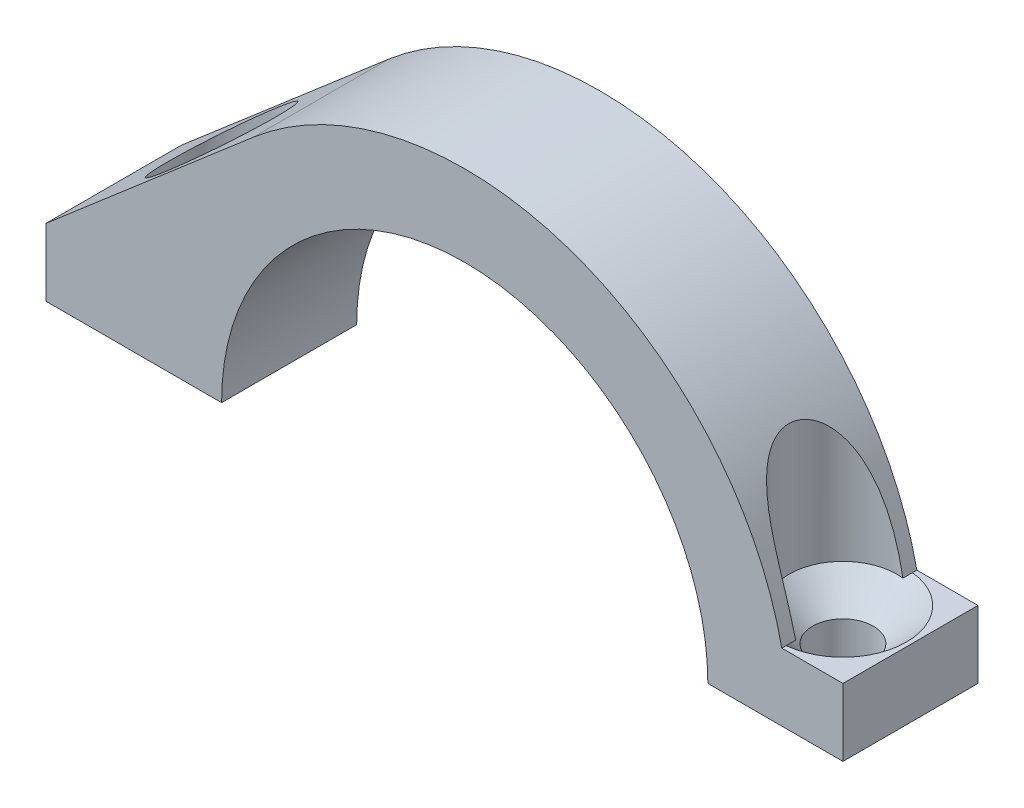
ISO-10303-21;
HEADER;
FILE_DESCRIPTION(('STEP AP214'),'2;1');
FILE_NAME('part.step','',(''),(''),'','','');
FILE_SCHEMA(('AUTOMOTIVE_DESIGN { 1 0 10303 214 1 1 1 1 }'));
ENDSEC;
DATA;
#1=APPLICATION_CONTEXT('core data for automotive mechanical design processes');
#2=APPLICATION_PROTOCOL_DEFINITION('international standard','automotive_design',2000,#1);
#3=PRODUCT_CONTEXT('',#1,'mechanical');
#4=PRODUCT('Part','Part','',(#3));
#5=PRODUCT_RELATED_PRODUCT_CATEGORY('part','',(#4));
#6=PRODUCT_DEFINITION_FORMATION('','',#4);
#7=PRODUCT_DEFINITION_CONTEXT('part definition',#1,'design');
#8=PRODUCT_DEFINITION('design','',#6,#7);
#9=PRODUCT_DEFINITION_SHAPE('','',#8);
#10=(LENGTH_UNIT() NAMED_UNIT(*) SI_UNIT(.MILLI.,.METRE.));
#11=(NAMED_UNIT(*) PLANE_ANGLE_UNIT() SI_UNIT($,.RADIAN.));
#12=(NAMED_UNIT(*) SI_UNIT($,.STERADIAN.) SOLID_ANGLE_UNIT());
#13=UNCERTAINTY_MEASURE_WITH_UNIT(LENGTH_MEASURE(1.E-05),#10,'distance_accuracy_value','');
#14=(GEOMETRIC_REPRESENTATION_CONTEXT(3) GLOBAL_UNCERTAINTY_ASSIGNED_CONTEXT((#13)) GLOBAL_UNIT_ASSIGNED_CONTEXT((#10,
#11,#12)) REPRESENTATION_CONTEXT('',''));
#15=CARTESIAN_POINT('',(0.,0.,0.));
#16=DIRECTION('',(0.,0.,1.));
#17=DIRECTION('',(1.,0.,0.));
#18=AXIS2_PLACEMENT_3D('',#15,#16,#17);
#19=CARTESIAN_POINT('',(77.,31.,131.694583757177));
#20=DIRECTION('',(0.,-1.,0.));
#21=DIRECTION('',(0.,0.,-1.));
#22=AXIS2_PLACEMENT_3D('',#19,#20,#21);
#23=PLANE('',#22);
#24=CARTESIAN_POINT('',(72.,31.,63.));
#25=DIRECTION('',(0.,1.,0.));
#26=DIRECTION('',(0.,0.,1.));
#27=AXIS2_PLACEMENT_3D('',#24,#25,#26);
#28=CIRCLE('',#27,4.7);
#29=CARTESIAN_POINT('',(72.473389188611,31.,67.6760990874987));
#30=VERTEX_POINT('',#29);
#31=CARTESIAN_POINT('',(72.473389188611,31.,58.3239009125013));
#32=VERTEX_POINT('',#31);
#33=EDGE_CURVE('E122',#30,#32,#28,.T.);
#34=ORIENTED_EDGE('',*,*,#33,.F.);
#35=DIRECTION('',(0.,0.,-1.));
#36=VECTOR('',#35,1.);
#37=CARTESIAN_POINT('',(72.473389188611,31.,131.694583757177));
#38=LINE('',#37,#36);
#39=CARTESIAN_POINT('',(72.473389188611,31.,68.));
#40=VERTEX_POINT('',#39);
#41=EDGE_CURVE('E61',#40,#30,#38,.T.);
#42=ORIENTED_EDGE('',*,*,#41,.F.);
#43=DIRECTION('',(-1.,0.,0.));
#44=VECTOR('',#43,1.);
#45=CARTESIAN_POINT('',(77.,31.,68.));
#46=LINE('',#45,#44);
#47=CARTESIAN_POINT('',(77.,31.,68.));
#48=VERTEX_POINT('',#47);
#49=EDGE_CURVE('E168',#48,#40,#46,.T.);
#50=ORIENTED_EDGE('',*,*,#49,.F.);
#51=DIRECTION('',(0.,0.,-1.));
#52=VECTOR('',#51,1.);
#53=CARTESIAN_POINT('',(77.,31.,131.694583757177));
#54=LINE('',#53,#52);
#55=CARTESIAN_POINT('',(77.,31.,58.));
#56=VERTEX_POINT('',#55);
#57=EDGE_CURVE('E185',#48,#56,#54,.T.);
#58=ORIENTED_EDGE('',*,*,#57,.T.);
#59=DIRECTION('',(-1.,0.,0.));
#60=VECTOR('',#59,1.);
#61=CARTESIAN_POINT('',(77.,31.,58.));
#62=LINE('',#61,#60);
#63=CARTESIAN_POINT('',(72.473389188611,31.,58.));
#64=VERTEX_POINT('',#63);
#65=EDGE_CURVE('E131',#56,#64,#62,.T.);
#66=ORIENTED_EDGE('',*,*,#65,.T.);
#67=EDGE_CURVE('E129',#32,#64,#38,.T.);
#68=ORIENTED_EDGE('',*,*,#67,.F.);
#69=EDGE_LOOP('',(#34,#42,#50,#58,#66,#68));
#70=FACE_BOUND('',#69,.T.);
#71=ADVANCED_FACE('F37',(#70),#23,.F.);
#72=CARTESIAN_POINT('',(49.,26.,131.694583757177));
#73=DIRECTION('',(0.,0.,-1.));
#74=DIRECTION('',(-1.,0.,0.));
#75=AXIS2_PLACEMENT_3D('',#72,#73,#74);
#76=CYLINDRICAL_SURFACE('',#75,24.);
#77=CARTESIAN_POINT('',(72.473389188611,31.,66.9718890563693));
#78=CARTESIAN_POINT('',(72.4250650791664,31.2268711392969,66.9776331855018));
#79=CARTESIAN_POINT('',(72.3734461474687,31.4530587467021,66.9829056037757));
#80=CARTESIAN_POINT('',(72.2636570800879,31.9039039872218,66.9916852627396));
#81=CARTESIAN_POINT('',(72.2054860659855,32.128561410897,66.9951922664));
#82=CARTESIAN_POINT('',(72.0824145924022,32.5769591768231,66.9996256302939));
#83=CARTESIAN_POINT('',(72.01748978205,32.8006929482492,67.0005422913498));
#84=CARTESIAN_POINT('',(71.881159260786,33.2461578035322,66.9988156818458));
#85=CARTESIAN_POINT('',(71.8097538177651,33.4678889697548,66.9961725583749));
#86=CARTESIAN_POINT('',(71.6580581296328,33.9164581691707,66.9861067022832));
#87=CARTESIAN_POINT('',(71.5775508775882,34.1432196256084,66.9785273781311));
#88=CARTESIAN_POINT('',(71.4098570493667,34.593958392639,66.9571299540315));
#89=CARTESIAN_POINT('',(71.3226708749897,34.8179358697737,66.943312229138));
#90=CARTESIAN_POINT('',(71.1419758618108,35.262307236795,66.9079736779552));
#91=CARTESIAN_POINT('',(71.0484773968963,35.4827063019824,66.8864652524014));
#92=CARTESIAN_POINT('',(70.8553801827718,35.9196463809305,66.8340390674355));
#93=CARTESIAN_POINT('',(70.7557828287104,36.1361882625171,66.8031234535856));
#94=CARTESIAN_POINT('',(70.5520794699918,36.5623399473483,66.7302951539474));
#95=CARTESIAN_POINT('',(70.4480343805081,36.7719995622659,66.6885059005004));
#96=CARTESIAN_POINT('',(70.2351323873239,37.1858526701946,66.5915090250424));
#97=CARTESIAN_POINT('',(70.1262738007065,37.3900442107245,66.5362966791511));
#98=CARTESIAN_POINT('',(69.9058354978617,37.7897269717554,66.4103459934722));
#99=CARTESIAN_POINT('',(69.7942867073086,37.9852773131873,66.3397433652946));
#100=CARTESIAN_POINT('',(69.5693543955666,38.3673240849149,66.1797793305868));
#101=CARTESIAN_POINT('',(69.4559726315941,38.5538285720044,66.0904350088676));
#102=CARTESIAN_POINT('',(69.2315957300724,38.9122624591335,65.8910426614215));
#103=CARTESIAN_POINT('',(69.1205907869889,39.0843725514715,65.7813359046453));
#104=CARTESIAN_POINT('',(68.9028828163513,39.4132039539724,65.5366648682736));
#105=CARTESIAN_POINT('',(68.7961810731682,39.5699206894426,65.4016931146905));
#106=CARTESIAN_POINT('',(68.6085381504611,39.8393627962973,65.1263357240916));
#107=CARTESIAN_POINT('',(68.5261580898304,39.9551475145525,64.989969589615));
#108=CARTESIAN_POINT('',(68.3736099804366,40.166161917671,64.6960454600736));
#109=CARTESIAN_POINT('',(68.3034212633906,40.2614264580732,64.5385241501844));
#110=CARTESIAN_POINT('',(68.195343927833,40.4064230101088,64.2423325650273));
#111=CARTESIAN_POINT('',(68.153739293605,40.4615891360785,64.107696214171));
#112=CARTESIAN_POINT('',(68.0841806320974,40.5532601618473,63.8288246344592));
#113=CARTESIAN_POINT('',(68.0562171300845,40.5897780150216,63.6845961473697));
#114=CARTESIAN_POINT('',(68.0161930630766,40.6419099719296,63.3893313580019));
#115=CARTESIAN_POINT('',(68.0042225232088,40.6574057488873,63.2382614255921));
#116=CARTESIAN_POINT('',(67.9976563844559,40.6659160186484,62.9351138890682));
#117=CARTESIAN_POINT('',(68.0030573082591,40.6589350107145,62.7830364927036));
#118=CARTESIAN_POINT('',(68.029468436556,40.6246268988265,62.4961883473167));
#119=CARTESIAN_POINT('',(68.04908272042,40.5991188797448,62.3610613575964));
#120=CARTESIAN_POINT('',(68.1008009755964,40.5313870202061,62.0976164728754));
#121=CARTESIAN_POINT('',(68.132908660065,40.4891582101072,61.9693006151037));
#122=CARTESIAN_POINT('',(68.2191008817847,40.3747240802118,61.683396284398));
#123=CARTESIAN_POINT('',(68.2769111591643,40.297287037285,61.5290276392855));
#124=CARTESIAN_POINT('',(68.405412043333,40.1223869921584,61.2380778772918));
#125=CARTESIAN_POINT('',(68.476125793224,40.024887966903,61.1015294892161));
#126=CARTESIAN_POINT('',(68.6584534271508,39.7687734293612,60.7911464248248));
#127=CARTESIAN_POINT('',(68.7745339200808,39.6019573975962,60.6267087077138));
#128=CARTESIAN_POINT('',(68.9543843743535,39.335452131829,60.405139629645));
#129=CARTESIAN_POINT('',(69.0153727370295,39.2437733264225,60.3353900320692));
#130=CARTESIAN_POINT('',(69.1385066498199,39.0557698293778,60.2035776680283));
#131=CARTESIAN_POINT('',(69.2006520031764,38.959445923334,60.1415136080509));
#132=CARTESIAN_POINT('',(69.3672778895896,38.696920313221,59.9851617526234));
#133=CARTESIAN_POINT('',(69.4721755846451,38.5272131121888,59.8972072511601));
#134=CARTESIAN_POINT('',(69.6809689049098,38.1794398124759,59.7382038656125));
#135=CARTESIAN_POINT('',(69.7848637738868,38.0013679218141,59.6671669086951));
#136=CARTESIAN_POINT('',(69.9902640849288,37.6384013782892,59.5394204420879));
#137=CARTESIAN_POINT('',(70.0917646903898,37.4534945783345,59.4827379997436));
#138=CARTESIAN_POINT('',(70.2911700779734,37.0784125855758,59.3816583741471));
#139=CARTESIAN_POINT('',(70.3890734593067,36.8882353899614,59.3372659336599));
#140=CARTESIAN_POINT('',(70.5781616709814,36.5084169940377,59.2598735315324));
#141=CARTESIAN_POINT('',(70.6694530467959,36.3188801396474,59.2266176466991));
#142=CARTESIAN_POINT('',(70.8474574651507,35.936452479051,59.1684979626386));
#143=CARTESIAN_POINT('',(70.9341711156103,35.7435621227334,59.1436330467188));
#144=CARTESIAN_POINT('',(71.1028069646286,35.3547247536302,59.1009465931729));
#145=CARTESIAN_POINT('',(71.1847245934247,35.1587750439112,59.0831316828051));
#146=CARTESIAN_POINT('',(71.3434768493495,34.7643741290587,59.0534206633665));
#147=CARTESIAN_POINT('',(71.4203108762924,34.5659226318376,59.0415252520931));
#148=CARTESIAN_POINT('',(71.6429970785652,33.9671823948186,59.0131438773194));
#149=CARTESIAN_POINT('',(71.7809932807672,33.5636003076876,59.0039718658667));
#150=CARTESIAN_POINT('',(72.035208912042,32.7498764392346,58.9981397621313));
#151=CARTESIAN_POINT('',(72.1514403448888,32.3397384099504,59.0014727515856));
#152=CARTESIAN_POINT('',(72.2958782074375,31.7729802040001,59.0107661632584));
#153=CARTESIAN_POINT('',(72.3335745391265,31.6186768485066,59.0137679674909));
#154=CARTESIAN_POINT('',(72.4058176602134,31.3096906858641,59.0204741164517));
#155=CARTESIAN_POINT('',(72.4403708826279,31.1550093509678,59.0241769761407));
#156=CARTESIAN_POINT('',(72.473389188611,31.,59.0281109436307));
#157=B_SPLINE_CURVE_WITH_KNOTS('',3,(#77,#78,#79,#80,#81,#82,#83,#84,#85,#86,#87,#88,#89,#90,
#91,#92,#93,#94,#95,#96,#97,#98,#99,#100,#101,#102,#103,#104,#105,#106,#107,#108,#109,#110,#111,
#112,#113,#114,#115,#116,#117,#118,#119,#120,#121,#122,#123,#124,#125,#126,#127,#128,#129,#130,
#131,#132,#133,#134,#135,#136,#137,#138,#139,#140,#141,#142,#143,#144,#145,#146,#147,#148,#149,
#150,#151,#152,#153,#154,#155,#156),.UNSPECIFIED.,.F.,.F.,(4,2,2,2,2,2,2,2,2,2,2,2,2,2,2,2,2,2,
2,2,2,2,2,2,2,2,2,2,2,2,2,2,2,2,2,2,2,2,2,4),(0.,0.696079965731022,1.39225336428133,
2.09103005521188,2.78977787384722,3.51184886403787,4.23387644893941,4.95474502458975,
5.67544930986068,6.38830463881225,7.10141120123182,7.80846711829467,8.5148812670198,
9.21037920944285,9.90608322280558,10.4948744722677,11.0826575744074,11.5348480499809,
11.986723998433,12.4411330087113,12.8954510638791,13.310324888613,13.725322112045,
14.2686640601332,14.8129902760812,15.5926099098077,15.9834400374184,16.3742042968149,
17.0272603900001,17.6807755451872,18.3355139653647,18.9905047008536,19.6292022709265,
20.2678148078614,20.907026245569,21.5463130164085,22.8251892272896,24.1033580174219,
24.5799417050787,25.055526921944),.UNSPECIFIED.);
#158=CARTESIAN_POINT('',(72.473389188611,31.,66.9718890563693));
#159=VERTEX_POINT('',#158);
#160=CARTESIAN_POINT('',(72.473389188611,31.,59.0281109436307));
#161=VERTEX_POINT('',#160);
#162=EDGE_CURVE('E140',#159,#161,#157,.T.);
#163=ORIENTED_EDGE('',*,*,#162,.T.);
#164=EDGE_CURVE('E118',#161,#32,#38,.T.);
#165=ORIENTED_EDGE('',*,*,#164,.T.);
#166=ORIENTED_EDGE('',*,*,#67,.T.);
#167=CARTESIAN_POINT('',(49.,26.,58.));
#168=DIRECTION('',(0.,0.,1.));
#169=DIRECTION('',(1.,0.,0.));
#170=AXIS2_PLACEMENT_3D('',#167,#168,#169);
#171=CIRCLE('',#170,24.);
#172=CARTESIAN_POINT('',(33.35478175229,44.1996468641983,58.));
#173=VERTEX_POINT('',#172);
#174=EDGE_CURVE('E142',#64,#173,#171,.T.);
#175=ORIENTED_EDGE('',*,*,#174,.T.);
#176=DIRECTION('',(0.,0.,-1.));
#177=VECTOR('',#176,1.);
#178=CARTESIAN_POINT('',(33.35478175229,44.1996468641983,131.694583757177));
#179=LINE('',#178,#177);
#180=CARTESIAN_POINT('',(33.35478175229,44.1996468641983,68.));
#181=VERTEX_POINT('',#180);
#182=EDGE_CURVE('E143',#181,#173,#179,.T.);
#183=ORIENTED_EDGE('',*,*,#182,.F.);
#184=CARTESIAN_POINT('',(49.,26.,68.));
#185=DIRECTION('',(0.,0.,1.));
#186=DIRECTION('',(1.,0.,0.));
#187=AXIS2_PLACEMENT_3D('',#184,#185,#186);
#188=CIRCLE('',#187,24.);
#189=EDGE_CURVE('E165',#40,#181,#188,.T.);
#190=ORIENTED_EDGE('',*,*,#189,.F.);
#191=ORIENTED_EDGE('',*,*,#41,.T.);
#192=EDGE_CURVE('E121',#30,#159,#38,.T.);
#193=ORIENTED_EDGE('',*,*,#192,.T.);
#194=EDGE_LOOP('',(#163,#165,#166,#175,#183,#190,#191,#193));
#195=FACE_BOUND('',#194,.T.);
#196=ADVANCED_FACE('F138',(#195),#76,.T.);
#197=CARTESIAN_POINT('',(18.,31.,131.694583757177));
#198=DIRECTION('',(0.651884093654582,-0.758318619341596,0.));
#199=DIRECTION('',(0.758318619341596,0.651884093654582,0.));
#200=AXIS2_PLACEMENT_3D('',#197,#198,#199);
#201=PLANE('',#200);
#202=CARTESIAN_POINT('',(26.,37.8771524478254,63.));
#203=DIRECTION('',(0.651884093654582,-0.758318619341596,0.));
#204=DIRECTION('',(-0.758318619341596,-0.651884093654582,0.));
#205=AXIS2_PLACEMENT_3D('',#202,#203,#204);
#206=ELLIPSE('',#205,5.27482762255392,4.);
#207=CARTESIAN_POINT('',(22.,34.4385762239127,63.));
#208=VERTEX_POINT('',#207);
#209=EDGE_CURVE('E135',#208,#208,#206,.T.);
#210=ORIENTED_EDGE('',*,*,#209,.T.);
#211=EDGE_LOOP('',(#210));
#212=FACE_BOUND('',#211,.T.);
#213=DIRECTION('',(-0.758318619341596,-0.651884093654582,0.));
#214=VECTOR('',#213,1.);
#215=CARTESIAN_POINT('',(18.,31.,68.));
#216=LINE('',#215,#214);
#217=CARTESIAN_POINT('',(18.,31.,68.));
#218=VERTEX_POINT('',#217);
#219=EDGE_CURVE('E162',#181,#218,#216,.T.);
#220=ORIENTED_EDGE('',*,*,#219,.F.);
#221=ORIENTED_EDGE('',*,*,#182,.T.);
#222=DIRECTION('',(-0.758318619341596,-0.651884093654582,0.));
#223=VECTOR('',#222,1.);
#224=CARTESIAN_POINT('',(18.,31.,58.));
#225=LINE('',#224,#223);
#226=CARTESIAN_POINT('',(18.,31.,58.));
#227=VERTEX_POINT('',#226);
#228=EDGE_CURVE('E146',#173,#227,#225,.T.);
#229=ORIENTED_EDGE('',*,*,#228,.T.);
#230=DIRECTION('',(0.,0.,-1.));
#231=VECTOR('',#230,1.);
#232=CARTESIAN_POINT('',(18.,31.,131.694583757177));
#233=LINE('',#232,#231);
#234=EDGE_CURVE('E171',#218,#227,#233,.T.);
#235=ORIENTED_EDGE('',*,*,#234,.F.);
#236=EDGE_LOOP('',(#220,#221,#229,#235));
#237=FACE_BOUND('',#236,.T.);
#238=ADVANCED_FACE('F216',(#212,#237),#201,.F.);
#239=CARTESIAN_POINT('',(18.,26.,131.694583757177));
#240=DIRECTION('',(1.,0.,0.));
#241=DIRECTION('',(0.,0.,-1.));
#242=AXIS2_PLACEMENT_3D('',#239,#240,#241);
#243=PLANE('',#242);
#244=DIRECTION('',(0.,-1.,0.));
#245=VECTOR('',#244,1.);
#246=CARTESIAN_POINT('',(18.,26.,68.));
#247=LINE('',#246,#245);
#248=CARTESIAN_POINT('',(18.,26.,68.));
#249=VERTEX_POINT('',#248);
#250=EDGE_CURVE('E159',#218,#249,#247,.T.);
#251=ORIENTED_EDGE('',*,*,#250,.F.);
#252=ORIENTED_EDGE('',*,*,#234,.T.);
#253=DIRECTION('',(0.,-1.,0.));
#254=VECTOR('',#253,1.);
#255=CARTESIAN_POINT('',(18.,26.,58.));
#256=LINE('',#255,#254);
#257=CARTESIAN_POINT('',(18.,26.,58.));
#258=VERTEX_POINT('',#257);
#259=EDGE_CURVE('E173',#227,#258,#256,.T.);
#260=ORIENTED_EDGE('',*,*,#259,.T.);
#261=DIRECTION('',(0.,0.,-1.));
#262=VECTOR('',#261,1.);
#263=CARTESIAN_POINT('',(18.,26.,131.694583757177));
#264=LINE('',#263,#262);
#265=EDGE_CURVE('E174',#249,#258,#264,.T.);
#266=ORIENTED_EDGE('',*,*,#265,.F.);
#267=EDGE_LOOP('',(#251,#252,#260,#266));
#268=FACE_BOUND('',#267,.T.);
#269=ADVANCED_FACE('F203',(#268),#243,.F.);
#270=CARTESIAN_POINT('',(31.,26.,131.694583757177));
#271=DIRECTION('',(0.,1.,0.));
#272=DIRECTION('',(0.,0.,1.));
#273=AXIS2_PLACEMENT_3D('',#270,#271,#272);
#274=PLANE('',#273);
#275=CARTESIAN_POINT('',(26.,26.,63.));
#276=DIRECTION('',(0.,1.,0.));
#277=DIRECTION('',(0.,0.,1.));
#278=AXIS2_PLACEMENT_3D('',#275,#276,#277);
#279=CIRCLE('',#278,2.25);
#280=CARTESIAN_POINT('',(26.,26.,65.25));
#281=VERTEX_POINT('',#280);
#282=EDGE_CURVE('E41',#281,#281,#279,.T.);
#283=ORIENTED_EDGE('',*,*,#282,.T.);
#284=EDGE_LOOP('',(#283));
#285=FACE_BOUND('',#284,.T.);
#286=DIRECTION('',(1.,0.,0.));
#287=VECTOR('',#286,1.);
#288=CARTESIAN_POINT('',(31.,26.,68.));
#289=LINE('',#288,#287);
#290=CARTESIAN_POINT('',(31.,26.,68.));
#291=VERTEX_POINT('',#290);
#292=EDGE_CURVE('E156',#249,#291,#289,.T.);
#293=ORIENTED_EDGE('',*,*,#292,.F.);
#294=ORIENTED_EDGE('',*,*,#265,.T.);
#295=DIRECTION('',(1.,0.,0.));
#296=VECTOR('',#295,1.);
#297=CARTESIAN_POINT('',(31.,26.,58.));
#298=LINE('',#297,#296);
#299=CARTESIAN_POINT('',(31.,26.,58.));
#300=VERTEX_POINT('',#299);
#301=EDGE_CURVE('E176',#258,#300,#298,.T.);
#302=ORIENTED_EDGE('',*,*,#301,.T.);
#303=DIRECTION('',(0.,0.,-1.));
#304=VECTOR('',#303,1.);
#305=CARTESIAN_POINT('',(31.,26.,131.694583757177));
#306=LINE('',#305,#304);
#307=EDGE_CURVE('E177',#291,#300,#306,.T.);
#308=ORIENTED_EDGE('',*,*,#307,.F.);
#309=EDGE_LOOP('',(#293,#294,#302,#308));
#310=FACE_BOUND('',#309,.T.);
#311=ADVANCED_FACE('F213',(#285,#310),#274,.F.);
#312=CARTESIAN_POINT('',(49.,26.,131.694583757177));
#313=DIRECTION('',(0.,0.,-1.));
#314=DIRECTION('',(-1.,0.,0.));
#315=AXIS2_PLACEMENT_3D('',#312,#313,#314);
#316=CYLINDRICAL_SURFACE('',#315,18.);
#317=CARTESIAN_POINT('',(49.,26.,68.));
#318=DIRECTION('',(0.,0.,1.));
#319=DIRECTION('',(1.,0.,0.));
#320=AXIS2_PLACEMENT_3D('',#317,#318,#319);
#321=CIRCLE('',#320,18.);
#322=CARTESIAN_POINT('',(67.,26.,68.));
#323=VERTEX_POINT('',#322);
#324=EDGE_CURVE('E153',#291,#323,#321,.F.);
#325=ORIENTED_EDGE('',*,*,#324,.F.);
#326=ORIENTED_EDGE('',*,*,#307,.T.);
#327=CARTESIAN_POINT('',(49.,26.,58.));
#328=DIRECTION('',(0.,0.,-1.));
#329=DIRECTION('',(1.,0.,0.));
#330=AXIS2_PLACEMENT_3D('',#327,#328,#329);
#331=CIRCLE('',#330,18.);
#332=CARTESIAN_POINT('',(67.,26.,58.));
#333=VERTEX_POINT('',#332);
#334=EDGE_CURVE('E179',#300,#333,#331,.T.);
#335=ORIENTED_EDGE('',*,*,#334,.T.);
#336=DIRECTION('',(0.,0.,-1.));
#337=VECTOR('',#336,1.);
#338=CARTESIAN_POINT('',(67.,26.,131.694583757177));
#339=LINE('',#338,#337);
#340=EDGE_CURVE('E180',#323,#333,#339,.T.);
#341=ORIENTED_EDGE('',*,*,#340,.F.);
#342=EDGE_LOOP('',(#325,#326,#335,#341));
#343=FACE_BOUND('',#342,.T.);
#344=ADVANCED_FACE('F222',(#343),#316,.F.);
#345=CARTESIAN_POINT('',(67.,26.,131.694583757177));
#346=DIRECTION('',(0.,1.,0.));
#347=DIRECTION('',(0.,0.,1.));
#348=AXIS2_PLACEMENT_3D('',#345,#346,#347);
#349=PLANE('',#348);
#350=CARTESIAN_POINT('',(72.,26.,63.));
#351=DIRECTION('',(0.,1.,0.));
#352=DIRECTION('',(0.,0.,1.));
#353=AXIS2_PLACEMENT_3D('',#350,#351,#352);
#354=CIRCLE('',#353,2.25);
#355=CARTESIAN_POINT('',(72.,26.,65.25));
#356=VERTEX_POINT('',#355);
#357=EDGE_CURVE('E127',#356,#356,#354,.T.);
#358=ORIENTED_EDGE('',*,*,#357,.T.);
#359=EDGE_LOOP('',(#358));
#360=FACE_BOUND('',#359,.T.);
#361=DIRECTION('',(1.,0.,0.));
#362=VECTOR('',#361,1.);
#363=CARTESIAN_POINT('',(67.,26.,68.));
#364=LINE('',#363,#362);
#365=CARTESIAN_POINT('',(77.,26.,68.));
#366=VERTEX_POINT('',#365);
#367=EDGE_CURVE('E46',#323,#366,#364,.T.);
#368=ORIENTED_EDGE('',*,*,#367,.F.);
#369=ORIENTED_EDGE('',*,*,#340,.T.);
#370=DIRECTION('',(1.,0.,0.));
#371=VECTOR('',#370,1.);
#372=CARTESIAN_POINT('',(67.,26.,58.));
#373=LINE('',#372,#371);
#374=CARTESIAN_POINT('',(77.,26.,58.));
#375=VERTEX_POINT('',#374);
#376=EDGE_CURVE('E182',#333,#375,#373,.T.);
#377=ORIENTED_EDGE('',*,*,#376,.T.);
#378=DIRECTION('',(0.,0.,-1.));
#379=VECTOR('',#378,1.);
#380=CARTESIAN_POINT('',(77.,26.,131.694583757177));
#381=LINE('',#380,#379);
#382=EDGE_CURVE('E183',#366,#375,#381,.T.);
#383=ORIENTED_EDGE('',*,*,#382,.F.);
#384=EDGE_LOOP('',(#368,#369,#377,#383));
#385=FACE_BOUND('',#384,.T.);
#386=ADVANCED_FACE('F219',(#360,#385),#349,.F.);
#387=CARTESIAN_POINT('',(77.,26.,131.694583757177));
#388=DIRECTION('',(-1.,0.,0.));
#389=DIRECTION('',(0.,0.,1.));
#390=AXIS2_PLACEMENT_3D('',#387,#388,#389);
#391=PLANE('',#390);
#392=DIRECTION('',(0.,1.,0.));
#393=VECTOR('',#392,1.);
#394=CARTESIAN_POINT('',(77.,26.,68.));
#395=LINE('',#394,#393);
#396=EDGE_CURVE('E11',#366,#48,#395,.T.);
#397=ORIENTED_EDGE('',*,*,#396,.F.);
#398=ORIENTED_EDGE('',*,*,#382,.T.);
#399=DIRECTION('',(0.,1.,0.));
#400=VECTOR('',#399,1.);
#401=CARTESIAN_POINT('',(77.,26.,58.));
#402=LINE('',#401,#400);
#403=EDGE_CURVE('E184',#375,#56,#402,.T.);
#404=ORIENTED_EDGE('',*,*,#403,.T.);
#405=ORIENTED_EDGE('',*,*,#57,.F.);
#406=EDGE_LOOP('',(#397,#398,#404,#405));
#407=FACE_BOUND('',#406,.T.);
#408=ADVANCED_FACE('F229',(#407),#391,.F.);
#409=CARTESIAN_POINT('',(49.,26.,58.));
#410=DIRECTION('',(0.,0.,1.));
#411=DIRECTION('',(1.,0.,0.));
#412=AXIS2_PLACEMENT_3D('',#409,#410,#411);
#413=PLANE('',#412);
#414=ORIENTED_EDGE('',*,*,#174,.F.);
#415=ORIENTED_EDGE('',*,*,#65,.F.);
#416=ORIENTED_EDGE('',*,*,#403,.F.);
#417=ORIENTED_EDGE('',*,*,#376,.F.);
#418=ORIENTED_EDGE('',*,*,#334,.F.);
#419=ORIENTED_EDGE('',*,*,#301,.F.);
#420=ORIENTED_EDGE('',*,*,#259,.F.);
#421=ORIENTED_EDGE('',*,*,#228,.F.);
#422=EDGE_LOOP('',(#414,#415,#416,#417,#418,#419,#420,#421));
#423=FACE_BOUND('',#422,.T.);
#424=ADVANCED_FACE('F209',(#423),#413,.F.);
#425=CARTESIAN_POINT('',(49.,26.,68.));
#426=DIRECTION('',(0.,0.,1.));
#427=DIRECTION('',(1.,0.,0.));
#428=AXIS2_PLACEMENT_3D('',#425,#426,#427);
#429=PLANE('',#428);
#430=ORIENTED_EDGE('',*,*,#49,.T.);
#431=ORIENTED_EDGE('',*,*,#189,.T.);
#432=ORIENTED_EDGE('',*,*,#219,.T.);
#433=ORIENTED_EDGE('',*,*,#250,.T.);
#434=ORIENTED_EDGE('',*,*,#292,.T.);
#435=ORIENTED_EDGE('',*,*,#324,.T.);
#436=ORIENTED_EDGE('',*,*,#367,.T.);
#437=ORIENTED_EDGE('',*,*,#396,.T.);
#438=EDGE_LOOP('',(#430,#431,#432,#433,#434,#435,#436,#437));
#439=FACE_BOUND('',#438,.T.);
#440=ADVANCED_FACE('F39',(#439),#429,.T.);
#441=CARTESIAN_POINT('',(72.,50.001,63.));
#442=DIRECTION('',(0.,-1.,0.));
#443=DIRECTION('',(0.,0.,-1.));
#444=AXIS2_PLACEMENT_3D('',#441,#442,#443);
#445=CYLINDRICAL_SURFACE('',#444,4.00000000000001);
#446=CARTESIAN_POINT('',(72.,31.,63.));
#447=DIRECTION('',(0.,1.,0.));
#448=DIRECTION('',(0.,0.,1.));
#449=AXIS2_PLACEMENT_3D('',#446,#447,#448);
#450=CIRCLE('',#449,4.00000000000001);
#451=EDGE_CURVE('E270',#161,#159,#450,.T.);
#452=ORIENTED_EDGE('',*,*,#451,.F.);
#453=ORIENTED_EDGE('',*,*,#162,.F.);
#454=EDGE_LOOP('',(#452,#453));
#455=FACE_BOUND('',#454,.T.);
#456=ADVANCED_FACE('F249',(#455),#445,.F.);
#457=CARTESIAN_POINT('',(26.,50.001,63.));
#458=DIRECTION('',(0.,-1.,0.));
#459=DIRECTION('',(0.,0.,-1.));
#460=AXIS2_PLACEMENT_3D('',#457,#458,#459);
#461=CYLINDRICAL_SURFACE('',#460,4.);
#462=CARTESIAN_POINT('',(26.,31.,63.));
#463=DIRECTION('',(0.,1.,0.));
#464=DIRECTION('',(0.,0.,1.));
#465=AXIS2_PLACEMENT_3D('',#462,#463,#464);
#466=CIRCLE('',#465,4.);
#467=CARTESIAN_POINT('',(26.,31.,67.));
#468=VERTEX_POINT('',#467);
#469=EDGE_CURVE('E373',#468,#468,#466,.T.);
#470=ORIENTED_EDGE('',*,*,#469,.F.);
#471=EDGE_LOOP('',(#470));
#472=FACE_BOUND('',#471,.T.);
#473=ORIENTED_EDGE('',*,*,#209,.F.);
#474=EDGE_LOOP('',(#473));
#475=FACE_BOUND('',#474,.T.);
#476=ADVANCED_FACE('F253',(#472,#475),#461,.F.);
#477=CARTESIAN_POINT('',(72.,31.,63.));
#478=DIRECTION('',(0.,1.,0.));
#479=DIRECTION('',(0.,0.,1.));
#480=AXIS2_PLACEMENT_3D('',#477,#478,#479);
#481=CYLINDRICAL_SURFACE('',#480,2.25);
#482=CARTESIAN_POINT('',(72.,28.55,63.));
#483=DIRECTION('',(0.,1.,0.));
#484=DIRECTION('',(0.,0.,1.));
#485=AXIS2_PLACEMENT_3D('',#482,#483,#484);
#486=CIRCLE('',#485,2.25);
#487=CARTESIAN_POINT('',(72.,28.55,65.25));
#488=VERTEX_POINT('',#487);
#489=EDGE_CURVE('E123',#488,#488,#486,.T.);
#490=ORIENTED_EDGE('',*,*,#489,.T.);
#491=EDGE_LOOP('',(#490));
#492=FACE_BOUND('',#491,.T.);
#493=ORIENTED_EDGE('',*,*,#357,.F.);
#494=EDGE_LOOP('',(#493));
#495=FACE_BOUND('',#494,.T.);
#496=ADVANCED_FACE('F258',(#492,#495),#481,.F.);
#497=CARTESIAN_POINT('',(72.,31.,63.));
#498=DIRECTION('',(0.,1.,0.));
#499=DIRECTION('',(0.,0.,1.));
#500=AXIS2_PLACEMENT_3D('',#497,#498,#499);
#501=PLANE('',#500);
#502=ORIENTED_EDGE('',*,*,#451,.T.);
#503=ORIENTED_EDGE('',*,*,#192,.F.);
#504=EDGE_CURVE('E53',#32,#30,#28,.T.);
#505=ORIENTED_EDGE('',*,*,#504,.F.);
#506=ORIENTED_EDGE('',*,*,#164,.F.);
#507=EDGE_LOOP('',(#502,#503,#505,#506));
#508=FACE_BOUND('',#507,.T.);
#509=ADVANCED_FACE('F116',(#508),#501,.F.);
#510=CARTESIAN_POINT('',(72.,31.,63.));
#511=DIRECTION('',(0.,1.,0.));
#512=DIRECTION('',(0.,0.,1.));
#513=AXIS2_PLACEMENT_3D('',#510,#511,#512);
#514=CONICAL_SURFACE('',#513,4.7,0.785398163397447);
#515=ORIENTED_EDGE('',*,*,#489,.F.);
#516=EDGE_LOOP('',(#515));
#517=FACE_BOUND('',#516,.T.);
#518=ORIENTED_EDGE('',*,*,#33,.T.);
#519=ORIENTED_EDGE('',*,*,#504,.T.);
#520=EDGE_LOOP('',(#518,#519));
#521=FACE_BOUND('',#520,.T.);
#522=ADVANCED_FACE('F126',(#517,#521),#514,.F.);
#523=CARTESIAN_POINT('',(26.,31.,63.));
#524=DIRECTION('',(0.,1.,0.));
#525=DIRECTION('',(0.,0.,1.));
#526=AXIS2_PLACEMENT_3D('',#523,#524,#525);
#527=CYLINDRICAL_SURFACE('',#526,2.25);
#528=CARTESIAN_POINT('',(26.,28.55,63.));
#529=DIRECTION('',(0.,1.,0.));
#530=DIRECTION('',(0.,0.,1.));
#531=AXIS2_PLACEMENT_3D('',#528,#529,#530);
#532=CIRCLE('',#531,2.25);
#533=CARTESIAN_POINT('',(26.,28.55,65.25));
#534=VERTEX_POINT('',#533);
#535=EDGE_CURVE('E368',#534,#534,#532,.T.);
#536=ORIENTED_EDGE('',*,*,#535,.T.);
#537=EDGE_LOOP('',(#536));
#538=FACE_BOUND('',#537,.T.);
#539=ORIENTED_EDGE('',*,*,#282,.F.);
#540=EDGE_LOOP('',(#539));
#541=FACE_BOUND('',#540,.T.);
#542=ADVANCED_FACE('F331',(#538,#541),#527,.F.);
#543=CARTESIAN_POINT('',(26.,31.,63.));
#544=DIRECTION('',(0.,1.,0.));
#545=DIRECTION('',(0.,0.,1.));
#546=AXIS2_PLACEMENT_3D('',#543,#544,#545);
#547=PLANE('',#546);
#548=ORIENTED_EDGE('',*,*,#469,.T.);
#549=EDGE_LOOP('',(#548));
#550=FACE_BOUND('',#549,.T.);
#551=CARTESIAN_POINT('',(26.,31.,63.));
#552=DIRECTION('',(0.,1.,0.));
#553=DIRECTION('',(0.,0.,1.));
#554=AXIS2_PLACEMENT_3D('',#551,#552,#553);
#555=CIRCLE('',#554,4.7);
#556=CARTESIAN_POINT('',(26.,31.,67.7));
#557=VERTEX_POINT('',#556);
#558=EDGE_CURVE('E371',#557,#557,#555,.T.);
#559=ORIENTED_EDGE('',*,*,#558,.F.);
#560=EDGE_LOOP('',(#559));
#561=FACE_BOUND('',#560,.T.);
#562=ADVANCED_FACE('F341',(#550,#561),#547,.F.);
#563=CARTESIAN_POINT('',(26.,31.,63.));
#564=DIRECTION('',(0.,1.,0.));
#565=DIRECTION('',(0.,0.,1.));
#566=AXIS2_PLACEMENT_3D('',#563,#564,#565);
#567=CONICAL_SURFACE('',#566,4.7,0.785398163397448);
#568=ORIENTED_EDGE('',*,*,#535,.F.);
#569=EDGE_LOOP('',(#568));
#570=FACE_BOUND('',#569,.T.);
#571=ORIENTED_EDGE('',*,*,#558,.T.);
#572=EDGE_LOOP('',(#571));
#573=FACE_BOUND('',#572,.T.);
#574=ADVANCED_FACE('F351',(#570,#573),#567,.F.);
#575=CLOSED_SHELL('',(#71,#196,#238,#269,#311,#344,#386,#408,#424,#440,#456,#476,#496,#509,#522,
#542,#562,#574));
#576=MANIFOLD_SOLID_BREP('B2',#575);
#577=ADVANCED_BREP_SHAPE_REPRESENTATION('',(#18,#576),#14);
#578=SHAPE_DEFINITION_REPRESENTATION(#9,#577);
ENDSEC;
END-ISO-10303-21;
